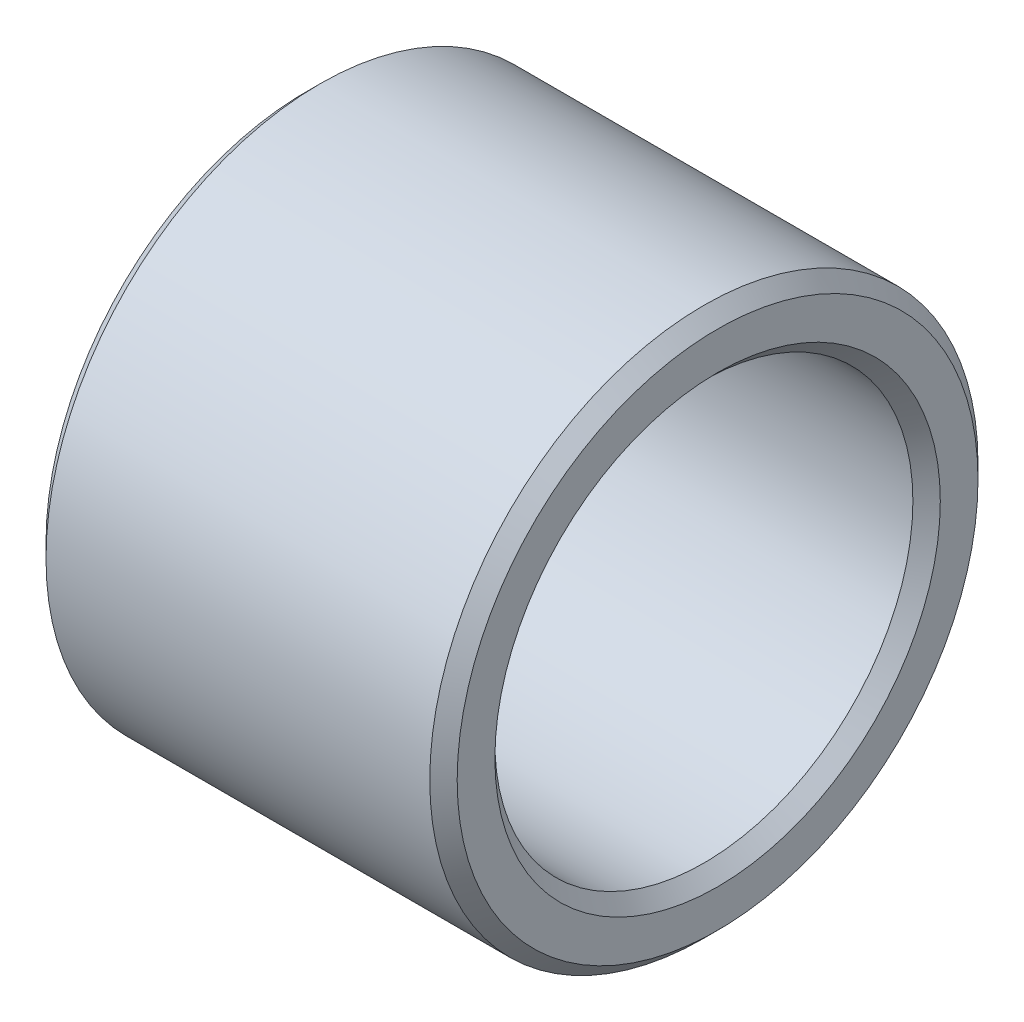
ISO-10303-21;
HEADER;
FILE_DESCRIPTION(('STEP AP214'),'2;1');
FILE_NAME('part.step','',(''),(''),'','','');
FILE_SCHEMA(('AUTOMOTIVE_DESIGN { 1 0 10303 214 1 1 1 1 }'));
ENDSEC;
DATA;
#1=APPLICATION_CONTEXT('core data for automotive mechanical design processes');
#2=APPLICATION_PROTOCOL_DEFINITION('international standard','automotive_design',2000,#1);
#3=PRODUCT_CONTEXT('',#1,'mechanical');
#4=PRODUCT('Part','Part','',(#3));
#5=PRODUCT_RELATED_PRODUCT_CATEGORY('part','',(#4));
#6=PRODUCT_DEFINITION_FORMATION('','',#4);
#7=PRODUCT_DEFINITION_CONTEXT('part definition',#1,'design');
#8=PRODUCT_DEFINITION('design','',#6,#7);
#9=PRODUCT_DEFINITION_SHAPE('','',#8);
#10=(LENGTH_UNIT() NAMED_UNIT(*) SI_UNIT(.MILLI.,.METRE.));
#11=(NAMED_UNIT(*) PLANE_ANGLE_UNIT() SI_UNIT($,.RADIAN.));
#12=(NAMED_UNIT(*) SI_UNIT($,.STERADIAN.) SOLID_ANGLE_UNIT());
#13=UNCERTAINTY_MEASURE_WITH_UNIT(LENGTH_MEASURE(1.E-05),#10,'distance_accuracy_value','');
#14=(GEOMETRIC_REPRESENTATION_CONTEXT(3) GLOBAL_UNCERTAINTY_ASSIGNED_CONTEXT((#13)) GLOBAL_UNIT_ASSIGNED_CONTEXT((#10,
#11,#12)) REPRESENTATION_CONTEXT('',''));
#15=CARTESIAN_POINT('',(0.,0.,0.));
#16=DIRECTION('',(0.,0.,1.));
#17=DIRECTION('',(1.,0.,0.));
#18=AXIS2_PLACEMENT_3D('',#15,#16,#17);
#19=CARTESIAN_POINT('',(0.,20.,0.));
#20=DIRECTION('',(-1.,0.,0.));
#21=DIRECTION('',(0.,0.,1.));
#22=AXIS2_PLACEMENT_3D('',#19,#20,#21);
#23=PLANE('',#22);
#24=CARTESIAN_POINT('',(0.,0.,0.));
#25=DIRECTION('',(-1.,0.,0.));
#26=DIRECTION('',(0.,0.,1.));
#27=AXIS2_PLACEMENT_3D('',#24,#25,#26);
#28=CIRCLE('',#27,16.25);
#29=CARTESIAN_POINT('',(0.,0.,16.25));
#30=VERTEX_POINT('',#29);
#31=EDGE_CURVE('E11',#30,#30,#28,.F.);
#32=ORIENTED_EDGE('',*,*,#31,.T.);
#33=EDGE_LOOP('',(#32));
#34=FACE_BOUND('',#33,.T.);
#35=CARTESIAN_POINT('',(0.,0.,0.));
#36=DIRECTION('',(-1.,0.,0.));
#37=DIRECTION('',(0.,0.,1.));
#38=AXIS2_PLACEMENT_3D('',#35,#36,#37);
#39=CIRCLE('',#38,19.);
#40=CARTESIAN_POINT('',(0.,0.,19.));
#41=VERTEX_POINT('',#40);
#42=EDGE_CURVE('E72',#41,#41,#39,.T.);
#43=ORIENTED_EDGE('',*,*,#42,.T.);
#44=EDGE_LOOP('',(#43));
#45=FACE_BOUND('',#44,.T.);
#46=ADVANCED_FACE('F43',(#34,#45),#23,.T.);
#47=CARTESIAN_POINT('',(0.,0.,0.));
#48=DIRECTION('',(1.,0.,0.));
#49=DIRECTION('',(0.,0.,-1.));
#50=AXIS2_PLACEMENT_3D('',#47,#48,#49);
#51=CYLINDRICAL_SURFACE('',#50,15.25);
#52=CARTESIAN_POINT('',(29.,0.,0.));
#53=DIRECTION('',(1.,0.,0.));
#54=DIRECTION('',(0.,0.,-1.));
#55=AXIS2_PLACEMENT_3D('',#52,#53,#54);
#56=CIRCLE('',#55,15.25);
#57=CARTESIAN_POINT('',(29.,0.,-15.25));
#58=VERTEX_POINT('',#57);
#59=EDGE_CURVE('E58',#58,#58,#56,.T.);
#60=ORIENTED_EDGE('',*,*,#59,.T.);
#61=EDGE_LOOP('',(#60));
#62=FACE_BOUND('',#61,.T.);
#63=CARTESIAN_POINT('',(1.00000000000002,0.,0.));
#64=DIRECTION('',(-1.,0.,0.));
#65=DIRECTION('',(0.,0.,1.));
#66=AXIS2_PLACEMENT_3D('',#63,#64,#65);
#67=CIRCLE('',#66,15.25);
#68=CARTESIAN_POINT('',(1.00000000000002,0.,15.25));
#69=VERTEX_POINT('',#68);
#70=EDGE_CURVE('E65',#69,#69,#67,.T.);
#71=ORIENTED_EDGE('',*,*,#70,.T.);
#72=EDGE_LOOP('',(#71));
#73=FACE_BOUND('',#72,.T.);
#74=ADVANCED_FACE('F111',(#62,#73),#51,.F.);
#75=CARTESIAN_POINT('',(30.,20.,0.));
#76=DIRECTION('',(1.,0.,0.));
#77=DIRECTION('',(0.,0.,-1.));
#78=AXIS2_PLACEMENT_3D('',#75,#76,#77);
#79=PLANE('',#78);
#80=CARTESIAN_POINT('',(30.,0.,0.));
#81=DIRECTION('',(1.,0.,0.));
#82=DIRECTION('',(0.,0.,-1.));
#83=AXIS2_PLACEMENT_3D('',#80,#81,#82);
#84=CIRCLE('',#83,16.25);
#85=CARTESIAN_POINT('',(30.,0.,-16.25));
#86=VERTEX_POINT('',#85);
#87=EDGE_CURVE('E52',#86,#86,#84,.F.);
#88=ORIENTED_EDGE('',*,*,#87,.T.);
#89=EDGE_LOOP('',(#88));
#90=FACE_BOUND('',#89,.T.);
#91=CARTESIAN_POINT('',(30.,0.,0.));
#92=DIRECTION('',(1.,0.,0.));
#93=DIRECTION('',(0.,0.,-1.));
#94=AXIS2_PLACEMENT_3D('',#91,#92,#93);
#95=CIRCLE('',#94,19.);
#96=CARTESIAN_POINT('',(30.,0.,-19.));
#97=VERTEX_POINT('',#96);
#98=EDGE_CURVE('E78',#97,#97,#95,.T.);
#99=ORIENTED_EDGE('',*,*,#98,.T.);
#100=EDGE_LOOP('',(#99));
#101=FACE_BOUND('',#100,.T.);
#102=ADVANCED_FACE('F103',(#90,#101),#79,.T.);
#103=CARTESIAN_POINT('',(0.,0.,0.));
#104=DIRECTION('',(1.,0.,0.));
#105=DIRECTION('',(0.,0.,-1.));
#106=AXIS2_PLACEMENT_3D('',#103,#104,#105);
#107=CYLINDRICAL_SURFACE('',#106,20.);
#108=CARTESIAN_POINT('',(29.,0.,0.));
#109=DIRECTION('',(1.,0.,0.));
#110=DIRECTION('',(0.,0.,-1.));
#111=AXIS2_PLACEMENT_3D('',#108,#109,#110);
#112=CIRCLE('',#111,20.);
#113=CARTESIAN_POINT('',(29.,0.,-20.));
#114=VERTEX_POINT('',#113);
#115=EDGE_CURVE('E85',#114,#114,#112,.F.);
#116=ORIENTED_EDGE('',*,*,#115,.T.);
#117=EDGE_LOOP('',(#116));
#118=FACE_BOUND('',#117,.T.);
#119=CARTESIAN_POINT('',(1.00000000000001,0.,0.));
#120=DIRECTION('',(-1.,0.,0.));
#121=DIRECTION('',(0.,0.,1.));
#122=AXIS2_PLACEMENT_3D('',#119,#120,#121);
#123=CIRCLE('',#122,20.);
#124=CARTESIAN_POINT('',(1.00000000000001,0.,20.));
#125=VERTEX_POINT('',#124);
#126=EDGE_CURVE('E82',#125,#125,#123,.F.);
#127=ORIENTED_EDGE('',*,*,#126,.T.);
#128=EDGE_LOOP('',(#127));
#129=FACE_BOUND('',#128,.T.);
#130=ADVANCED_FACE('F101',(#118,#129),#107,.T.);
#131=CARTESIAN_POINT('',(30.,0.,0.));
#132=DIRECTION('',(-1.,0.,0.));
#133=DIRECTION('',(0.,0.,1.));
#134=AXIS2_PLACEMENT_3D('',#131,#132,#133);
#135=CONICAL_SURFACE('',#134,19.,0.785398163397445);
#136=ORIENTED_EDGE('',*,*,#115,.F.);
#137=EDGE_LOOP('',(#136));
#138=FACE_BOUND('',#137,.T.);
#139=ORIENTED_EDGE('',*,*,#98,.F.);
#140=EDGE_LOOP('',(#139));
#141=FACE_BOUND('',#140,.T.);
#142=ADVANCED_FACE('F97',(#138,#141),#135,.T.);
#143=CARTESIAN_POINT('',(1.00000000000001,0.,0.));
#144=DIRECTION('',(1.,0.,0.));
#145=DIRECTION('',(0.,0.,-1.));
#146=AXIS2_PLACEMENT_3D('',#143,#144,#145);
#147=CONICAL_SURFACE('',#146,20.,0.785398163397448);
#148=ORIENTED_EDGE('',*,*,#42,.F.);
#149=EDGE_LOOP('',(#148));
#150=FACE_BOUND('',#149,.T.);
#151=ORIENTED_EDGE('',*,*,#126,.F.);
#152=EDGE_LOOP('',(#151));
#153=FACE_BOUND('',#152,.T.);
#154=ADVANCED_FACE('F93',(#150,#153),#147,.T.);
#155=CARTESIAN_POINT('',(29.,0.,0.));
#156=DIRECTION('',(1.,0.,0.));
#157=DIRECTION('',(0.,0.,-1.));
#158=AXIS2_PLACEMENT_3D('',#155,#156,#157);
#159=CONICAL_SURFACE('',#158,15.25,0.785398163397452);
#160=ORIENTED_EDGE('',*,*,#87,.F.);
#161=EDGE_LOOP('',(#160));
#162=FACE_BOUND('',#161,.T.);
#163=ORIENTED_EDGE('',*,*,#59,.F.);
#164=EDGE_LOOP('',(#163));
#165=FACE_BOUND('',#164,.T.);
#166=ADVANCED_FACE('F96',(#162,#165),#159,.F.);
#167=CARTESIAN_POINT('',(0.,0.,0.));
#168=DIRECTION('',(-1.,0.,0.));
#169=DIRECTION('',(0.,0.,1.));
#170=AXIS2_PLACEMENT_3D('',#167,#168,#169);
#171=CONICAL_SURFACE('',#170,16.25,0.785398163397446);
#172=ORIENTED_EDGE('',*,*,#70,.F.);
#173=EDGE_LOOP('',(#172));
#174=FACE_BOUND('',#173,.T.);
#175=ORIENTED_EDGE('',*,*,#31,.F.);
#176=EDGE_LOOP('',(#175));
#177=FACE_BOUND('',#176,.T.);
#178=ADVANCED_FACE('F46',(#174,#177),#171,.F.);
#179=CLOSED_SHELL('',(#46,#74,#102,#130,#142,#154,#166,#178));
#180=MANIFOLD_SOLID_BREP('B2',#179);
#181=ADVANCED_BREP_SHAPE_REPRESENTATION('',(#18,#180),#14);
#182=SHAPE_DEFINITION_REPRESENTATION(#9,#181);
ENDSEC;
END-ISO-10303-21;
